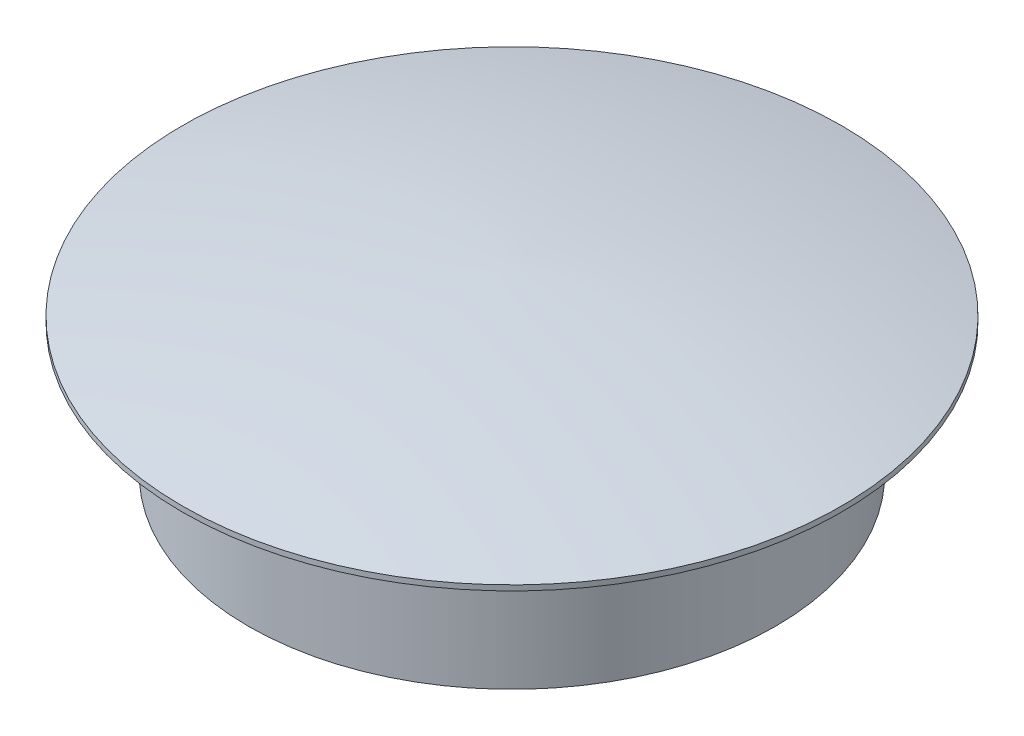
ISO-10303-21;
HEADER;
FILE_DESCRIPTION(('STEP AP214'),'2;1');
FILE_NAME('part.step','',(''),(''),'','','');
FILE_SCHEMA(('AUTOMOTIVE_DESIGN { 1 0 10303 214 1 1 1 1 }'));
ENDSEC;
DATA;
#1=APPLICATION_CONTEXT('core data for automotive mechanical design processes');
#2=APPLICATION_PROTOCOL_DEFINITION('international standard','automotive_design',2000,#1);
#3=PRODUCT_CONTEXT('',#1,'mechanical');
#4=PRODUCT('Part','Part','',(#3));
#5=PRODUCT_RELATED_PRODUCT_CATEGORY('part','',(#4));
#6=PRODUCT_DEFINITION_FORMATION('','',#4);
#7=PRODUCT_DEFINITION_CONTEXT('part definition',#1,'design');
#8=PRODUCT_DEFINITION('design','',#6,#7);
#9=PRODUCT_DEFINITION_SHAPE('','',#8);
#10=(LENGTH_UNIT() NAMED_UNIT(*) SI_UNIT(.MILLI.,.METRE.));
#11=(NAMED_UNIT(*) PLANE_ANGLE_UNIT() SI_UNIT($,.RADIAN.));
#12=(NAMED_UNIT(*) SI_UNIT($,.STERADIAN.) SOLID_ANGLE_UNIT());
#13=UNCERTAINTY_MEASURE_WITH_UNIT(LENGTH_MEASURE(1.E-05),#10,'distance_accuracy_value','');
#14=(GEOMETRIC_REPRESENTATION_CONTEXT(3) GLOBAL_UNCERTAINTY_ASSIGNED_CONTEXT((#13)) GLOBAL_UNIT_ASSIGNED_CONTEXT((#10,
#11,#12)) REPRESENTATION_CONTEXT('',''));
#15=CARTESIAN_POINT('',(0.,0.,0.));
#16=DIRECTION('',(0.,0.,1.));
#17=DIRECTION('',(1.,0.,0.));
#18=AXIS2_PLACEMENT_3D('',#15,#16,#17);
#19=CARTESIAN_POINT('',(0.,0.254,0.));
#20=DIRECTION('',(0.,-1.,0.));
#21=DIRECTION('',(0.,0.,-1.));
#22=AXIS2_PLACEMENT_3D('',#19,#20,#21);
#23=CYLINDRICAL_SURFACE('',#22,15.875);
#24=CARTESIAN_POINT('',(0.,0.254,0.));
#25=DIRECTION('',(0.,1.,0.));
#26=DIRECTION('',(0.,0.,1.));
#27=AXIS2_PLACEMENT_3D('',#24,#25,#26);
#28=CIRCLE('',#27,15.875);
#29=CARTESIAN_POINT('',(0.,0.254,15.875));
#30=VERTEX_POINT('',#29);
#31=EDGE_CURVE('E52',#30,#30,#28,.T.);
#32=ORIENTED_EDGE('',*,*,#31,.F.);
#33=EDGE_LOOP('',(#32));
#34=FACE_BOUND('',#33,.T.);
#35=CARTESIAN_POINT('',(0.,0.,0.));
#36=DIRECTION('',(0.,1.,0.));
#37=DIRECTION('',(0.,0.,1.));
#38=AXIS2_PLACEMENT_3D('',#35,#36,#37);
#39=CIRCLE('',#38,15.875);
#40=CARTESIAN_POINT('',(0.,0.,15.875));
#41=VERTEX_POINT('',#40);
#42=EDGE_CURVE('E79',#41,#41,#39,.T.);
#43=ORIENTED_EDGE('',*,*,#42,.T.);
#44=EDGE_LOOP('',(#43));
#45=FACE_BOUND('',#44,.T.);
#46=ADVANCED_FACE('F45',(#34,#45),#23,.T.);
#47=CARTESIAN_POINT('',(0.,0.,0.));
#48=DIRECTION('',(0.,1.,0.));
#49=DIRECTION('',(0.,0.,1.));
#50=AXIS2_PLACEMENT_3D('',#47,#48,#49);
#51=PLANE('',#50);
#52=CARTESIAN_POINT('',(0.,0.,0.));
#53=DIRECTION('',(0.,1.,0.));
#54=DIRECTION('',(0.,0.,1.));
#55=AXIS2_PLACEMENT_3D('',#52,#53,#54);
#56=CIRCLE('',#55,12.7);
#57=CARTESIAN_POINT('',(0.,0.,12.7));
#58=VERTEX_POINT('',#57);
#59=EDGE_CURVE('E11',#58,#58,#56,.F.);
#60=ORIENTED_EDGE('',*,*,#59,.F.);
#61=EDGE_LOOP('',(#60));
#62=FACE_BOUND('',#61,.T.);
#63=ORIENTED_EDGE('',*,*,#42,.F.);
#64=EDGE_LOOP('',(#63));
#65=FACE_BOUND('',#64,.T.);
#66=ADVANCED_FACE('F65',(#62,#65),#51,.F.);
#67=CARTESIAN_POINT('',(0.,-6.35,0.));
#68=DIRECTION('',(0.,1.,0.));
#69=DIRECTION('',(0.,0.,1.));
#70=AXIS2_PLACEMENT_3D('',#67,#68,#69);
#71=CYLINDRICAL_SURFACE('',#70,11.43);
#72=CARTESIAN_POINT('',(0.,-6.35,0.));
#73=DIRECTION('',(0.,-1.,0.));
#74=DIRECTION('',(0.,0.,-1.));
#75=AXIS2_PLACEMENT_3D('',#72,#73,#74);
#76=CIRCLE('',#75,11.43);
#77=CARTESIAN_POINT('',(0.,-6.35,-11.43));
#78=VERTEX_POINT('',#77);
#79=EDGE_CURVE('E87',#78,#78,#76,.T.);
#80=ORIENTED_EDGE('',*,*,#79,.T.);
#81=EDGE_LOOP('',(#80));
#82=FACE_BOUND('',#81,.T.);
#83=CARTESIAN_POINT('',(0.,0.,0.));
#84=DIRECTION('',(0.,-1.,0.));
#85=DIRECTION('',(0.,0.,-1.));
#86=AXIS2_PLACEMENT_3D('',#83,#84,#85);
#87=CIRCLE('',#86,11.43);
#88=CARTESIAN_POINT('',(0.,0.,-11.43));
#89=VERTEX_POINT('',#88);
#90=EDGE_CURVE('E90',#89,#89,#87,.T.);
#91=ORIENTED_EDGE('',*,*,#90,.F.);
#92=EDGE_LOOP('',(#91));
#93=FACE_BOUND('',#92,.T.);
#94=ADVANCED_FACE('F73',(#82,#93),#71,.F.);
#95=CARTESIAN_POINT('',(0.,-6.35,0.));
#96=DIRECTION('',(0.,1.,0.));
#97=DIRECTION('',(0.,0.,1.));
#98=AXIS2_PLACEMENT_3D('',#95,#96,#97);
#99=CYLINDRICAL_SURFACE('',#98,12.7);
#100=CARTESIAN_POINT('',(0.,-6.35,0.));
#101=DIRECTION('',(0.,-1.,0.));
#102=DIRECTION('',(0.,0.,-1.));
#103=AXIS2_PLACEMENT_3D('',#100,#101,#102);
#104=CIRCLE('',#103,12.7);
#105=CARTESIAN_POINT('',(0.,-6.35,-12.7));
#106=VERTEX_POINT('',#105);
#107=EDGE_CURVE('E82',#106,#106,#104,.T.);
#108=ORIENTED_EDGE('',*,*,#107,.F.);
#109=EDGE_LOOP('',(#108));
#110=FACE_BOUND('',#109,.T.);
#111=ORIENTED_EDGE('',*,*,#59,.T.);
#112=EDGE_LOOP('',(#111));
#113=FACE_BOUND('',#112,.T.);
#114=ADVANCED_FACE('F102',(#110,#113),#99,.T.);
#115=CARTESIAN_POINT('',(0.,-6.35,0.));
#116=DIRECTION('',(0.,-1.,0.));
#117=DIRECTION('',(0.,0.,-1.));
#118=AXIS2_PLACEMENT_3D('',#115,#116,#117);
#119=PLANE('',#118);
#120=ORIENTED_EDGE('',*,*,#79,.F.);
#121=EDGE_LOOP('',(#120));
#122=FACE_BOUND('',#121,.T.);
#123=ORIENTED_EDGE('',*,*,#107,.T.);
#124=EDGE_LOOP('',(#123));
#125=FACE_BOUND('',#124,.T.);
#126=ADVANCED_FACE('F63',(#122,#125),#119,.T.);
#127=ORIENTED_EDGE('',*,*,#90,.T.);
#128=EDGE_LOOP('',(#127));
#129=FACE_BOUND('',#128,.T.);
#130=ADVANCED_FACE('F57',(#129),#51,.F.);
#131=CARTESIAN_POINT('',(0.,-71.4390221245201,2.05184642260579));
#132=DIRECTION('',(-1.,0.,0.));
#133=DIRECTION('',(0.,0.,-1.));
#134=AXIS2_PLACEMENT_3D('',#131,#132,#133);
#135=CIRCLE('',#134,73.9003467110041);
#136=TRIMMED_CURVE('',#135,(PARAMETER_VALUE(-1.54302771361899)),
(PARAMETER_VALUE(1.54302771361899)),.T.,.PARAMETER.);
#137=CARTESIAN_POINT('',(0.,-71.4390221245201,0.));
#138=DIRECTION('',(0.,-1.,0.));
#139=AXIS1_PLACEMENT('',#137,#138);
#140=SURFACE_OF_REVOLUTION('',#136,#139);
#141=ORIENTED_EDGE('',*,*,#31,.T.);
#142=EDGE_LOOP('',(#141));
#143=FACE_BOUND('',#142,.T.);
#144=CARTESIAN_POINT('',(0.,2.43283429092855,0.));
#145=VERTEX_POINT('',#144);
#146=VERTEX_LOOP('',#145);
#147=FACE_BOUND('',#146,.T.);
#148=ADVANCED_FACE('F55',(#143,#147),#140,.T.);
#149=CLOSED_SHELL('',(#46,#66,#94,#114,#126,#130,#148));
#150=MANIFOLD_SOLID_BREP('B2',#149);
#151=ADVANCED_BREP_SHAPE_REPRESENTATION('',(#18,#150),#14);
#152=SHAPE_DEFINITION_REPRESENTATION(#9,#151);
ENDSEC;
END-ISO-10303-21;
